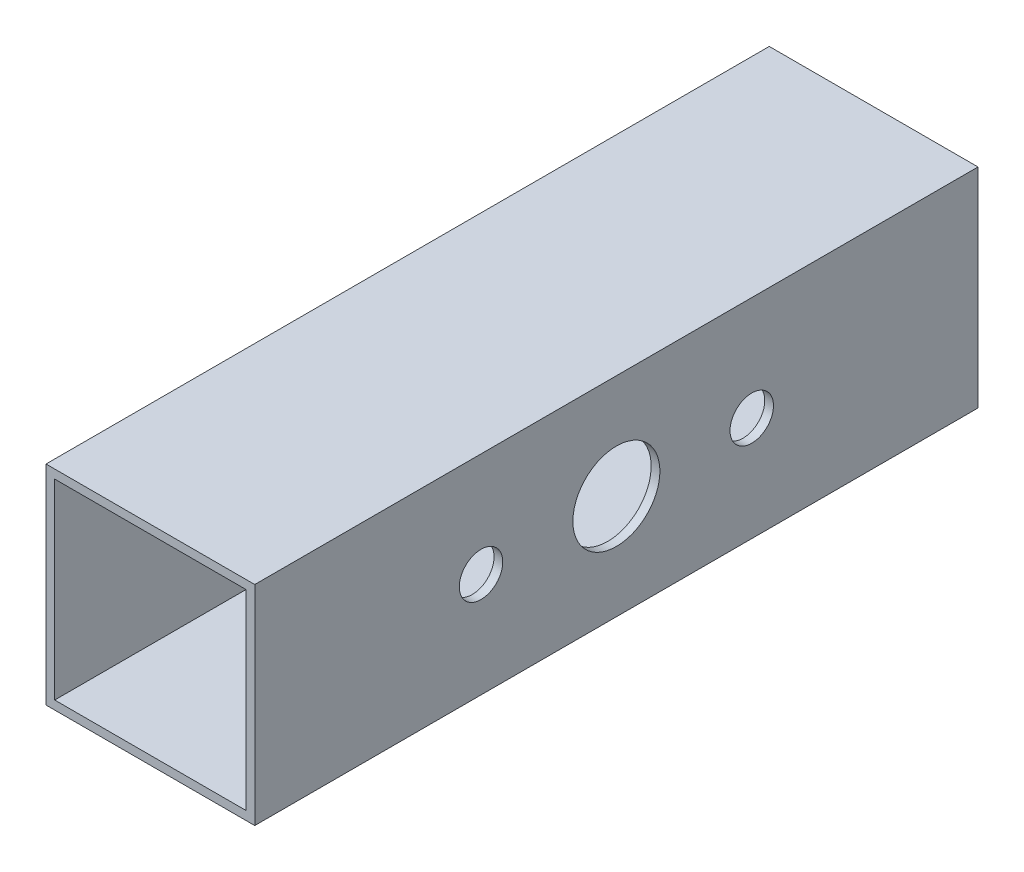
ISO-10303-21;
HEADER;
FILE_DESCRIPTION(('STEP AP214'),'2;1');
FILE_NAME('part.step','',(''),(''),'','','');
FILE_SCHEMA(('AUTOMOTIVE_DESIGN { 1 0 10303 214 1 1 1 1 }'));
ENDSEC;
DATA;
#1=APPLICATION_CONTEXT('core data for automotive mechanical design processes');
#2=APPLICATION_PROTOCOL_DEFINITION('international standard','automotive_design',2000,#1);
#3=PRODUCT_CONTEXT('',#1,'mechanical');
#4=PRODUCT('Part','Part','',(#3));
#5=PRODUCT_RELATED_PRODUCT_CATEGORY('part','',(#4));
#6=PRODUCT_DEFINITION_FORMATION('','',#4);
#7=PRODUCT_DEFINITION_CONTEXT('part definition',#1,'design');
#8=PRODUCT_DEFINITION('design','',#6,#7);
#9=PRODUCT_DEFINITION_SHAPE('','',#8);
#10=(LENGTH_UNIT() NAMED_UNIT(*) SI_UNIT(.MILLI.,.METRE.));
#11=(NAMED_UNIT(*) PLANE_ANGLE_UNIT() SI_UNIT($,.RADIAN.));
#12=(NAMED_UNIT(*) SI_UNIT($,.STERADIAN.) SOLID_ANGLE_UNIT());
#13=UNCERTAINTY_MEASURE_WITH_UNIT(LENGTH_MEASURE(1.E-05),#10,'distance_accuracy_value','');
#14=(GEOMETRIC_REPRESENTATION_CONTEXT(3) GLOBAL_UNCERTAINTY_ASSIGNED_CONTEXT((#13)) GLOBAL_UNIT_ASSIGNED_CONTEXT((#10,
#11,#12)) REPRESENTATION_CONTEXT('',''));
#15=CARTESIAN_POINT('',(0.,0.,0.));
#16=DIRECTION('',(0.,0.,1.));
#17=DIRECTION('',(1.,0.,0.));
#18=AXIS2_PLACEMENT_3D('',#15,#16,#17);
#19=CARTESIAN_POINT('',(0.,0.,132.));
#20=DIRECTION('',(0.,0.,-1.));
#21=DIRECTION('',(-1.,0.,0.));
#22=AXIS2_PLACEMENT_3D('',#19,#20,#21);
#23=PLANE('',#22);
#24=DIRECTION('',(0.,1.,0.));
#25=VECTOR('',#24,1.);
#26=CARTESIAN_POINT('',(-38.1,-38.1,132.));
#27=LINE('',#26,#25);
#28=CARTESIAN_POINT('',(-38.1,-38.1,132.));
#29=VERTEX_POINT('',#28);
#30=CARTESIAN_POINT('',(-38.1,38.1,132.));
#31=VERTEX_POINT('',#30);
#32=EDGE_CURVE('E167',#29,#31,#27,.T.);
#33=ORIENTED_EDGE('',*,*,#32,.F.);
#34=DIRECTION('',(1.,0.,0.));
#35=VECTOR('',#34,1.);
#36=CARTESIAN_POINT('',(-38.1,-38.1,132.));
#37=LINE('',#36,#35);
#38=CARTESIAN_POINT('',(38.1,-38.1,132.));
#39=VERTEX_POINT('',#38);
#40=EDGE_CURVE('E175',#29,#39,#37,.T.);
#41=ORIENTED_EDGE('',*,*,#40,.T.);
#42=DIRECTION('',(0.,1.,0.));
#43=VECTOR('',#42,1.);
#44=CARTESIAN_POINT('',(38.1,-38.1,132.));
#45=LINE('',#44,#43);
#46=CARTESIAN_POINT('',(38.1,38.1,132.));
#47=VERTEX_POINT('',#46);
#48=EDGE_CURVE('E174',#39,#47,#45,.T.);
#49=ORIENTED_EDGE('',*,*,#48,.T.);
#50=DIRECTION('',(1.,0.,0.));
#51=VECTOR('',#50,1.);
#52=CARTESIAN_POINT('',(-38.1,38.1,132.));
#53=LINE('',#52,#51);
#54=EDGE_CURVE('E166',#31,#47,#53,.T.);
#55=ORIENTED_EDGE('',*,*,#54,.F.);
#56=EDGE_LOOP('',(#33,#41,#49,#55));
#57=FACE_BOUND('',#56,.T.);
#58=DIRECTION('',(1.,0.,0.));
#59=VECTOR('',#58,1.);
#60=CARTESIAN_POINT('',(0.,-34.925,132.));
#61=LINE('',#60,#59);
#62=CARTESIAN_POINT('',(-34.925,-34.925,132.));
#63=VERTEX_POINT('',#62);
#64=CARTESIAN_POINT('',(34.925,-34.925,132.));
#65=VERTEX_POINT('',#64);
#66=EDGE_CURVE('E129',#63,#65,#61,.T.);
#67=ORIENTED_EDGE('',*,*,#66,.F.);
#68=DIRECTION('',(0.,1.,0.));
#69=VECTOR('',#68,1.);
#70=CARTESIAN_POINT('',(-34.925,0.,132.));
#71=LINE('',#70,#69);
#72=CARTESIAN_POINT('',(-34.925,34.925,132.));
#73=VERTEX_POINT('',#72);
#74=EDGE_CURVE('E149',#63,#73,#71,.T.);
#75=ORIENTED_EDGE('',*,*,#74,.T.);
#76=DIRECTION('',(1.,0.,0.));
#77=VECTOR('',#76,1.);
#78=CARTESIAN_POINT('',(0.,34.925,132.));
#79=LINE('',#78,#77);
#80=CARTESIAN_POINT('',(34.925,34.925,132.));
#81=VERTEX_POINT('',#80);
#82=EDGE_CURVE('E80',#73,#81,#79,.T.);
#83=ORIENTED_EDGE('',*,*,#82,.T.);
#84=DIRECTION('',(0.,1.,0.));
#85=VECTOR('',#84,1.);
#86=CARTESIAN_POINT('',(34.925,0.,132.));
#87=LINE('',#86,#85);
#88=EDGE_CURVE('E139',#65,#81,#87,.T.);
#89=ORIENTED_EDGE('',*,*,#88,.F.);
#90=EDGE_LOOP('',(#67,#75,#83,#89));
#91=FACE_BOUND('',#90,.T.);
#92=ADVANCED_FACE('F64',(#57,#91),#23,.F.);
#93=CARTESIAN_POINT('',(0.,0.,-132.));
#94=DIRECTION('',(0.,0.,-1.));
#95=DIRECTION('',(-1.,0.,0.));
#96=AXIS2_PLACEMENT_3D('',#93,#94,#95);
#97=PLANE('',#96);
#98=DIRECTION('',(0.,1.,0.));
#99=VECTOR('',#98,1.);
#100=CARTESIAN_POINT('',(-38.1,-38.1,-132.));
#101=LINE('',#100,#99);
#102=CARTESIAN_POINT('',(-38.1,-38.1,-132.));
#103=VERTEX_POINT('',#102);
#104=CARTESIAN_POINT('',(-38.1,38.1,-132.));
#105=VERTEX_POINT('',#104);
#106=EDGE_CURVE('E144',#103,#105,#101,.T.);
#107=ORIENTED_EDGE('',*,*,#106,.T.);
#108=DIRECTION('',(1.,0.,0.));
#109=VECTOR('',#108,1.);
#110=CARTESIAN_POINT('',(-38.1,38.1,-132.));
#111=LINE('',#110,#109);
#112=CARTESIAN_POINT('',(38.1,38.1,-132.));
#113=VERTEX_POINT('',#112);
#114=EDGE_CURVE('E178',#105,#113,#111,.T.);
#115=ORIENTED_EDGE('',*,*,#114,.T.);
#116=DIRECTION('',(0.,1.,0.));
#117=VECTOR('',#116,1.);
#118=CARTESIAN_POINT('',(38.1,-38.1,-132.));
#119=LINE('',#118,#117);
#120=CARTESIAN_POINT('',(38.1,-38.1,-132.));
#121=VERTEX_POINT('',#120);
#122=EDGE_CURVE('E181',#121,#113,#119,.T.);
#123=ORIENTED_EDGE('',*,*,#122,.F.);
#124=DIRECTION('',(1.,0.,0.));
#125=VECTOR('',#124,1.);
#126=CARTESIAN_POINT('',(-38.1,-38.1,-132.));
#127=LINE('',#126,#125);
#128=EDGE_CURVE('E168',#103,#121,#127,.T.);
#129=ORIENTED_EDGE('',*,*,#128,.F.);
#130=EDGE_LOOP('',(#107,#115,#123,#129));
#131=FACE_BOUND('',#130,.T.);
#132=DIRECTION('',(0.,1.,0.));
#133=VECTOR('',#132,1.);
#134=CARTESIAN_POINT('',(-34.925,0.,-132.));
#135=LINE('',#134,#133);
#136=CARTESIAN_POINT('',(-34.925,-34.925,-132.));
#137=VERTEX_POINT('',#136);
#138=CARTESIAN_POINT('',(-34.925,34.925,-132.));
#139=VERTEX_POINT('',#138);
#140=EDGE_CURVE('E136',#137,#139,#135,.T.);
#141=ORIENTED_EDGE('',*,*,#140,.F.);
#142=DIRECTION('',(1.,0.,0.));
#143=VECTOR('',#142,1.);
#144=CARTESIAN_POINT('',(0.,-34.925,-132.));
#145=LINE('',#144,#143);
#146=CARTESIAN_POINT('',(34.925,-34.925,-132.));
#147=VERTEX_POINT('',#146);
#148=EDGE_CURVE('E86',#137,#147,#145,.T.);
#149=ORIENTED_EDGE('',*,*,#148,.T.);
#150=DIRECTION('',(0.,1.,0.));
#151=VECTOR('',#150,1.);
#152=CARTESIAN_POINT('',(34.925,0.,-132.));
#153=LINE('',#152,#151);
#154=CARTESIAN_POINT('',(34.925,34.925,-132.));
#155=VERTEX_POINT('',#154);
#156=EDGE_CURVE('E145',#147,#155,#153,.T.);
#157=ORIENTED_EDGE('',*,*,#156,.T.);
#158=DIRECTION('',(1.,0.,0.));
#159=VECTOR('',#158,1.);
#160=CARTESIAN_POINT('',(0.,34.925,-132.));
#161=LINE('',#160,#159);
#162=EDGE_CURVE('E160',#139,#155,#161,.T.);
#163=ORIENTED_EDGE('',*,*,#162,.F.);
#164=EDGE_LOOP('',(#141,#149,#157,#163));
#165=FACE_BOUND('',#164,.T.);
#166=ADVANCED_FACE('F240',(#131,#165),#97,.T.);
#167=CARTESIAN_POINT('',(-38.1,-38.1,132.));
#168=DIRECTION('',(-1.,0.,0.));
#169=DIRECTION('',(0.,0.,1.));
#170=AXIS2_PLACEMENT_3D('',#167,#168,#169);
#171=PLANE('',#170);
#172=CARTESIAN_POINT('',(-38.1,0.,-49.4109375));
#173=DIRECTION('',(-1.,0.,0.));
#174=DIRECTION('',(0.,0.,1.));
#175=AXIS2_PLACEMENT_3D('',#172,#173,#174);
#176=CIRCLE('',#175,7.93749999999999);
#177=CARTESIAN_POINT('',(-38.1,0.,-41.4734375));
#178=VERTEX_POINT('',#177);
#179=EDGE_CURVE('E281',#178,#178,#176,.T.);
#180=ORIENTED_EDGE('',*,*,#179,.F.);
#181=EDGE_LOOP('',(#180));
#182=FACE_BOUND('',#181,.T.);
#183=CARTESIAN_POINT('',(-38.1,0.,49.4109375));
#184=DIRECTION('',(-1.,0.,0.));
#185=DIRECTION('',(0.,0.,1.));
#186=AXIS2_PLACEMENT_3D('',#183,#184,#185);
#187=CIRCLE('',#186,7.93749999999999);
#188=CARTESIAN_POINT('',(-38.1,0.,57.3484375));
#189=VERTEX_POINT('',#188);
#190=EDGE_CURVE('E285',#189,#189,#187,.T.);
#191=ORIENTED_EDGE('',*,*,#190,.F.);
#192=EDGE_LOOP('',(#191));
#193=FACE_BOUND('',#192,.T.);
#194=CARTESIAN_POINT('',(-38.1,0.,0.));
#195=DIRECTION('',(-1.,0.,0.));
#196=DIRECTION('',(0.,0.,1.));
#197=AXIS2_PLACEMENT_3D('',#194,#195,#196);
#198=CIRCLE('',#197,15.875);
#199=CARTESIAN_POINT('',(-38.1,0.,15.875));
#200=VERTEX_POINT('',#199);
#201=EDGE_CURVE('E208',#200,#200,#198,.T.);
#202=ORIENTED_EDGE('',*,*,#201,.F.);
#203=EDGE_LOOP('',(#202));
#204=FACE_BOUND('',#203,.T.);
#205=ORIENTED_EDGE('',*,*,#106,.F.);
#206=DIRECTION('',(0.,0.,-1.));
#207=VECTOR('',#206,1.);
#208=CARTESIAN_POINT('',(-38.1,-38.1,132.));
#209=LINE('',#208,#207);
#210=EDGE_CURVE('E12',#29,#103,#209,.T.);
#211=ORIENTED_EDGE('',*,*,#210,.F.);
#212=ORIENTED_EDGE('',*,*,#32,.T.);
#213=DIRECTION('',(0.,0.,-1.));
#214=VECTOR('',#213,1.);
#215=CARTESIAN_POINT('',(-38.1,38.1,132.));
#216=LINE('',#215,#214);
#217=EDGE_CURVE('E180',#31,#105,#216,.T.);
#218=ORIENTED_EDGE('',*,*,#217,.T.);
#219=EDGE_LOOP('',(#205,#211,#212,#218));
#220=FACE_BOUND('',#219,.T.);
#221=ADVANCED_FACE('F65',(#182,#193,#204,#220),#171,.T.);
#222=CARTESIAN_POINT('',(-38.1,-38.1,132.));
#223=DIRECTION('',(0.,1.,0.));
#224=DIRECTION('',(0.,0.,1.));
#225=AXIS2_PLACEMENT_3D('',#222,#223,#224);
#226=PLANE('',#225);
#227=ORIENTED_EDGE('',*,*,#128,.T.);
#228=DIRECTION('',(0.,0.,-1.));
#229=VECTOR('',#228,1.);
#230=CARTESIAN_POINT('',(38.1,-38.1,132.));
#231=LINE('',#230,#229);
#232=EDGE_CURVE('E75',#39,#121,#231,.T.);
#233=ORIENTED_EDGE('',*,*,#232,.F.);
#234=ORIENTED_EDGE('',*,*,#40,.F.);
#235=ORIENTED_EDGE('',*,*,#210,.T.);
#236=EDGE_LOOP('',(#227,#233,#234,#235));
#237=FACE_BOUND('',#236,.T.);
#238=ADVANCED_FACE('F246',(#237),#226,.F.);
#239=CARTESIAN_POINT('',(38.1,-38.1,132.));
#240=DIRECTION('',(-1.,0.,0.));
#241=DIRECTION('',(0.,0.,1.));
#242=AXIS2_PLACEMENT_3D('',#239,#240,#241);
#243=PLANE('',#242);
#244=CARTESIAN_POINT('',(38.1,0.,-49.4109375));
#245=DIRECTION('',(-1.,0.,0.));
#246=DIRECTION('',(0.,0.,1.));
#247=AXIS2_PLACEMENT_3D('',#244,#245,#246);
#248=CIRCLE('',#247,7.93749999999999);
#249=CARTESIAN_POINT('',(38.1,0.,-41.4734375));
#250=VERTEX_POINT('',#249);
#251=EDGE_CURVE('E296',#250,#250,#248,.T.);
#252=ORIENTED_EDGE('',*,*,#251,.T.);
#253=EDGE_LOOP('',(#252));
#254=FACE_BOUND('',#253,.T.);
#255=CARTESIAN_POINT('',(38.1,0.,49.4109375));
#256=DIRECTION('',(-1.,0.,0.));
#257=DIRECTION('',(0.,0.,1.));
#258=AXIS2_PLACEMENT_3D('',#255,#256,#257);
#259=CIRCLE('',#258,7.93749999999999);
#260=CARTESIAN_POINT('',(38.1,0.,57.3484375));
#261=VERTEX_POINT('',#260);
#262=EDGE_CURVE('E288',#261,#261,#259,.T.);
#263=ORIENTED_EDGE('',*,*,#262,.T.);
#264=EDGE_LOOP('',(#263));
#265=FACE_BOUND('',#264,.T.);
#266=CARTESIAN_POINT('',(38.1,0.,0.));
#267=DIRECTION('',(-1.,0.,0.));
#268=DIRECTION('',(0.,0.,1.));
#269=AXIS2_PLACEMENT_3D('',#266,#267,#268);
#270=CIRCLE('',#269,15.875);
#271=CARTESIAN_POINT('',(38.1,0.,15.875));
#272=VERTEX_POINT('',#271);
#273=EDGE_CURVE('E193',#272,#272,#270,.T.);
#274=ORIENTED_EDGE('',*,*,#273,.T.);
#275=EDGE_LOOP('',(#274));
#276=FACE_BOUND('',#275,.T.);
#277=ORIENTED_EDGE('',*,*,#122,.T.);
#278=DIRECTION('',(0.,0.,-1.));
#279=VECTOR('',#278,1.);
#280=CARTESIAN_POINT('',(38.1,38.1,132.));
#281=LINE('',#280,#279);
#282=EDGE_CURVE('E188',#47,#113,#281,.T.);
#283=ORIENTED_EDGE('',*,*,#282,.F.);
#284=ORIENTED_EDGE('',*,*,#48,.F.);
#285=ORIENTED_EDGE('',*,*,#232,.T.);
#286=EDGE_LOOP('',(#277,#283,#284,#285));
#287=FACE_BOUND('',#286,.T.);
#288=ADVANCED_FACE('F252',(#254,#265,#276,#287),#243,.F.);
#289=CARTESIAN_POINT('',(-38.1,38.1,132.));
#290=DIRECTION('',(0.,1.,0.));
#291=DIRECTION('',(-1.,0.,0.));
#292=AXIS2_PLACEMENT_3D('',#289,#290,#291);
#293=PLANE('',#292);
#294=ORIENTED_EDGE('',*,*,#114,.F.);
#295=ORIENTED_EDGE('',*,*,#217,.F.);
#296=ORIENTED_EDGE('',*,*,#54,.T.);
#297=ORIENTED_EDGE('',*,*,#282,.T.);
#298=EDGE_LOOP('',(#294,#295,#296,#297));
#299=FACE_BOUND('',#298,.T.);
#300=ADVANCED_FACE('F254',(#299),#293,.T.);
#301=CARTESIAN_POINT('',(0.,-34.925,132.));
#302=DIRECTION('',(0.,1.,0.));
#303=DIRECTION('',(-1.,0.,0.));
#304=AXIS2_PLACEMENT_3D('',#301,#302,#303);
#305=PLANE('',#304);
#306=ORIENTED_EDGE('',*,*,#148,.F.);
#307=DIRECTION('',(0.,0.,-1.));
#308=VECTOR('',#307,1.);
#309=CARTESIAN_POINT('',(-34.925,-34.925,132.));
#310=LINE('',#309,#308);
#311=EDGE_CURVE('E134',#63,#137,#310,.T.);
#312=ORIENTED_EDGE('',*,*,#311,.F.);
#313=ORIENTED_EDGE('',*,*,#66,.T.);
#314=DIRECTION('',(0.,0.,-1.));
#315=VECTOR('',#314,1.);
#316=CARTESIAN_POINT('',(34.925,-34.925,132.));
#317=LINE('',#316,#315);
#318=EDGE_CURVE('E132',#65,#147,#317,.T.);
#319=ORIENTED_EDGE('',*,*,#318,.T.);
#320=EDGE_LOOP('',(#306,#312,#313,#319));
#321=FACE_BOUND('',#320,.T.);
#322=ADVANCED_FACE('F131',(#321),#305,.T.);
#323=CARTESIAN_POINT('',(34.925,0.,132.));
#324=DIRECTION('',(-1.,0.,0.));
#325=DIRECTION('',(0.,0.,1.));
#326=AXIS2_PLACEMENT_3D('',#323,#324,#325);
#327=PLANE('',#326);
#328=CARTESIAN_POINT('',(34.925,0.,-49.4109375));
#329=DIRECTION('',(-1.,0.,0.));
#330=DIRECTION('',(0.,0.,1.));
#331=AXIS2_PLACEMENT_3D('',#328,#329,#330);
#332=CIRCLE('',#331,7.93749999999999);
#333=CARTESIAN_POINT('',(34.925,0.,-41.4734375));
#334=VERTEX_POINT('',#333);
#335=EDGE_CURVE('E154',#334,#334,#332,.T.);
#336=ORIENTED_EDGE('',*,*,#335,.F.);
#337=EDGE_LOOP('',(#336));
#338=FACE_BOUND('',#337,.T.);
#339=CARTESIAN_POINT('',(34.925,0.,49.4109375));
#340=DIRECTION('',(-1.,0.,0.));
#341=DIRECTION('',(0.,0.,1.));
#342=AXIS2_PLACEMENT_3D('',#339,#340,#341);
#343=CIRCLE('',#342,7.93749999999999);
#344=CARTESIAN_POINT('',(34.925,0.,57.3484375));
#345=VERTEX_POINT('',#344);
#346=EDGE_CURVE('E196',#345,#345,#343,.T.);
#347=ORIENTED_EDGE('',*,*,#346,.F.);
#348=EDGE_LOOP('',(#347));
#349=FACE_BOUND('',#348,.T.);
#350=CARTESIAN_POINT('',(34.925,0.,0.));
#351=DIRECTION('',(-1.,0.,0.));
#352=DIRECTION('',(0.,0.,1.));
#353=AXIS2_PLACEMENT_3D('',#350,#351,#352);
#354=CIRCLE('',#353,15.875);
#355=CARTESIAN_POINT('',(34.925,0.,15.875));
#356=VERTEX_POINT('',#355);
#357=EDGE_CURVE('E191',#356,#356,#354,.T.);
#358=ORIENTED_EDGE('',*,*,#357,.F.);
#359=EDGE_LOOP('',(#358));
#360=FACE_BOUND('',#359,.T.);
#361=ORIENTED_EDGE('',*,*,#156,.F.);
#362=ORIENTED_EDGE('',*,*,#318,.F.);
#363=ORIENTED_EDGE('',*,*,#88,.T.);
#364=DIRECTION('',(0.,0.,-1.));
#365=VECTOR('',#364,1.);
#366=CARTESIAN_POINT('',(34.925,34.925,132.));
#367=LINE('',#366,#365);
#368=EDGE_CURVE('E148',#81,#155,#367,.T.);
#369=ORIENTED_EDGE('',*,*,#368,.T.);
#370=EDGE_LOOP('',(#361,#362,#363,#369));
#371=FACE_BOUND('',#370,.T.);
#372=ADVANCED_FACE('F142',(#338,#349,#360,#371),#327,.T.);
#373=CARTESIAN_POINT('',(0.,34.925,132.));
#374=DIRECTION('',(0.,1.,0.));
#375=DIRECTION('',(-1.,0.,0.));
#376=AXIS2_PLACEMENT_3D('',#373,#374,#375);
#377=PLANE('',#376);
#378=ORIENTED_EDGE('',*,*,#162,.T.);
#379=ORIENTED_EDGE('',*,*,#368,.F.);
#380=ORIENTED_EDGE('',*,*,#82,.F.);
#381=DIRECTION('',(0.,0.,-1.));
#382=VECTOR('',#381,1.);
#383=CARTESIAN_POINT('',(-34.925,34.925,132.));
#384=LINE('',#383,#382);
#385=EDGE_CURVE('E162',#73,#139,#384,.T.);
#386=ORIENTED_EDGE('',*,*,#385,.T.);
#387=EDGE_LOOP('',(#378,#379,#380,#386));
#388=FACE_BOUND('',#387,.T.);
#389=ADVANCED_FACE('F314',(#388),#377,.F.);
#390=CARTESIAN_POINT('',(-34.925,0.,132.));
#391=DIRECTION('',(-1.,0.,0.));
#392=DIRECTION('',(0.,0.,1.));
#393=AXIS2_PLACEMENT_3D('',#390,#391,#392);
#394=PLANE('',#393);
#395=CARTESIAN_POINT('',(-34.925,0.,-49.4109375));
#396=DIRECTION('',(-1.,0.,0.));
#397=DIRECTION('',(0.,0.,1.));
#398=AXIS2_PLACEMENT_3D('',#395,#396,#397);
#399=CIRCLE('',#398,7.93749999999999);
#400=CARTESIAN_POINT('',(-34.925,0.,-41.4734375));
#401=VERTEX_POINT('',#400);
#402=EDGE_CURVE('E70',#401,#401,#399,.T.);
#403=ORIENTED_EDGE('',*,*,#402,.T.);
#404=EDGE_LOOP('',(#403));
#405=FACE_BOUND('',#404,.T.);
#406=CARTESIAN_POINT('',(-34.925,0.,49.4109375));
#407=DIRECTION('',(-1.,0.,0.));
#408=DIRECTION('',(0.,0.,1.));
#409=AXIS2_PLACEMENT_3D('',#406,#407,#408);
#410=CIRCLE('',#409,7.93749999999999);
#411=CARTESIAN_POINT('',(-34.925,0.,57.3484375));
#412=VERTEX_POINT('',#411);
#413=EDGE_CURVE('E198',#412,#412,#410,.T.);
#414=ORIENTED_EDGE('',*,*,#413,.T.);
#415=EDGE_LOOP('',(#414));
#416=FACE_BOUND('',#415,.T.);
#417=CARTESIAN_POINT('',(-34.925,0.,0.));
#418=DIRECTION('',(-1.,0.,0.));
#419=DIRECTION('',(0.,0.,1.));
#420=AXIS2_PLACEMENT_3D('',#417,#418,#419);
#421=CIRCLE('',#420,15.875);
#422=CARTESIAN_POINT('',(-34.925,0.,15.875));
#423=VERTEX_POINT('',#422);
#424=EDGE_CURVE('E195',#423,#423,#421,.T.);
#425=ORIENTED_EDGE('',*,*,#424,.T.);
#426=EDGE_LOOP('',(#425));
#427=FACE_BOUND('',#426,.T.);
#428=ORIENTED_EDGE('',*,*,#140,.T.);
#429=ORIENTED_EDGE('',*,*,#385,.F.);
#430=ORIENTED_EDGE('',*,*,#74,.F.);
#431=ORIENTED_EDGE('',*,*,#311,.T.);
#432=EDGE_LOOP('',(#428,#429,#430,#431));
#433=FACE_BOUND('',#432,.T.);
#434=ADVANCED_FACE('F216',(#405,#416,#427,#433),#394,.F.);
#435=CARTESIAN_POINT('',(38.1,0.,0.));
#436=DIRECTION('',(-1.,0.,0.));
#437=DIRECTION('',(0.,0.,1.));
#438=AXIS2_PLACEMENT_3D('',#435,#436,#437);
#439=CYLINDRICAL_SURFACE('',#438,15.875);
#440=CARTESIAN_POINT('',(-38.1,0.,15.875));
#441=CARTESIAN_POINT('',(-38.0669270833333,0.,15.875));
#442=CARTESIAN_POINT('',(-38.0338541666667,0.,15.875));
#443=CARTESIAN_POINT('',(-37.9677083333333,0.,15.875));
#444=CARTESIAN_POINT('',(-37.9346354166667,0.,15.875));
#445=CARTESIAN_POINT('',(-37.8684895833333,0.,15.875));
#446=CARTESIAN_POINT('',(-37.8354166666667,0.,15.875));
#447=CARTESIAN_POINT('',(-37.7692708333333,0.,15.875));
#448=CARTESIAN_POINT('',(-37.7361979166667,0.,15.875));
#449=CARTESIAN_POINT('',(-37.6700520833333,0.,15.875));
#450=CARTESIAN_POINT('',(-37.6369791666667,0.,15.875));
#451=CARTESIAN_POINT('',(-37.5708333333333,0.,15.875));
#452=CARTESIAN_POINT('',(-37.5377604166667,0.,15.875));
#453=CARTESIAN_POINT('',(-37.4716145833333,0.,15.875));
#454=CARTESIAN_POINT('',(-37.4385416666667,0.,15.875));
#455=CARTESIAN_POINT('',(-37.3723958333333,0.,15.875));
#456=CARTESIAN_POINT('',(-37.3393229166667,0.,15.875));
#457=CARTESIAN_POINT('',(-37.2731770833333,0.,15.875));
#458=CARTESIAN_POINT('',(-37.2401041666667,0.,15.875));
#459=CARTESIAN_POINT('',(-37.1739583333333,0.,15.875));
#460=CARTESIAN_POINT('',(-37.1408854166667,0.,15.875));
#461=CARTESIAN_POINT('',(-37.0747395833333,0.,15.875));
#462=CARTESIAN_POINT('',(-37.0416666666667,0.,15.875));
#463=CARTESIAN_POINT('',(-36.9755208333333,0.,15.875));
#464=CARTESIAN_POINT('',(-36.9424479166667,0.,15.875));
#465=CARTESIAN_POINT('',(-36.8763020833333,0.,15.875));
#466=CARTESIAN_POINT('',(-36.8432291666667,0.,15.875));
#467=CARTESIAN_POINT('',(-36.7770833333333,0.,15.875));
#468=CARTESIAN_POINT('',(-36.7440104166667,0.,15.875));
#469=CARTESIAN_POINT('',(-36.6778645833333,0.,15.875));
#470=CARTESIAN_POINT('',(-36.6447916666667,0.,15.875));
#471=CARTESIAN_POINT('',(-36.5786458333333,0.,15.875));
#472=CARTESIAN_POINT('',(-36.5455729166667,0.,15.875));
#473=CARTESIAN_POINT('',(-36.4794270833333,0.,15.875));
#474=CARTESIAN_POINT('',(-36.4463541666667,0.,15.875));
#475=CARTESIAN_POINT('',(-36.3802083333333,0.,15.875));
#476=CARTESIAN_POINT('',(-36.3471354166667,0.,15.875));
#477=CARTESIAN_POINT('',(-36.2809895833333,0.,15.875));
#478=CARTESIAN_POINT('',(-36.2479166666667,0.,15.875));
#479=CARTESIAN_POINT('',(-36.1817708333333,0.,15.875));
#480=CARTESIAN_POINT('',(-36.1486979166667,0.,15.875));
#481=CARTESIAN_POINT('',(-36.0825520833333,0.,15.875));
#482=CARTESIAN_POINT('',(-36.0494791666667,0.,15.875));
#483=CARTESIAN_POINT('',(-35.9833333333333,0.,15.875));
#484=CARTESIAN_POINT('',(-35.9502604166667,0.,15.875));
#485=CARTESIAN_POINT('',(-35.8841145833333,0.,15.875));
#486=CARTESIAN_POINT('',(-35.8510416666667,0.,15.875));
#487=CARTESIAN_POINT('',(-35.7848958333333,0.,15.875));
#488=CARTESIAN_POINT('',(-35.7518229166667,0.,15.875));
#489=CARTESIAN_POINT('',(-35.6856770833333,0.,15.875));
#490=CARTESIAN_POINT('',(-35.6526041666667,0.,15.875));
#491=CARTESIAN_POINT('',(-35.5864583333333,0.,15.875));
#492=CARTESIAN_POINT('',(-35.5533854166667,0.,15.875));
#493=CARTESIAN_POINT('',(-35.4872395833333,0.,15.875));
#494=CARTESIAN_POINT('',(-35.4541666666667,0.,15.875));
#495=CARTESIAN_POINT('',(-35.3880208333333,0.,15.875));
#496=CARTESIAN_POINT('',(-35.3549479166667,0.,15.875));
#497=CARTESIAN_POINT('',(-35.2888020833333,0.,15.875));
#498=CARTESIAN_POINT('',(-35.2557291666667,0.,15.875));
#499=CARTESIAN_POINT('',(-35.1895833333333,0.,15.875));
#500=CARTESIAN_POINT('',(-35.1565104166667,0.,15.875));
#501=CARTESIAN_POINT('',(-35.0903645833333,0.,15.875));
#502=CARTESIAN_POINT('',(-35.0572916666667,0.,15.875));
#503=CARTESIAN_POINT('',(-34.9911458333333,0.,15.875));
#504=CARTESIAN_POINT('',(-34.9580729166667,0.,15.875));
#505=CARTESIAN_POINT('',(-34.925,0.,15.875));
#506=B_SPLINE_CURVE_WITH_KNOTS('',3,(#440,#441,#442,#443,#444,#445,#446,#447,#448,#449,#450,
#451,#452,#453,#454,#455,#456,#457,#458,#459,#460,#461,#462,#463,#464,#465,#466,#467,#468,#469,
#470,#471,#472,#473,#474,#475,#476,#477,#478,#479,#480,#481,#482,#483,#484,#485,#486,#487,#488,
#489,#490,#491,#492,#493,#494,#495,#496,#497,#498,#499,#500,#501,#502,#503,#504,#505),
.UNSPECIFIED.,.F.,.F.,(4,2,2,2,2,2,2,2,2,2,2,2,2,2,2,2,2,2,2,2,2,2,2,2,2,2,2,2,2,2,2,2,4),(0.,
0.0992187500000047,0.198437499999995,0.29765625,0.396875000000005,0.496093749999996,0.5953125,
0.694531250000005,0.79375000000001,0.892968750000001,0.992187500000005,1.09140625000001,
1.190625,1.28984375000001,1.38906250000001,1.48828125,1.58750000000001,1.68671875000001,
1.7859375,1.88515625000001,1.98437500000001,2.08359375,2.18281250000001,2.28203125000001,
2.38125,2.48046875000001,2.57968750000001,2.67890625000002,2.77812500000001,2.87734375000001,
2.97656250000002,3.07578125000001,3.17500000000001),.UNSPECIFIED.);
#507=EDGE_CURVE('BSEAM232',#200,#423,#506,.T.);
#508=ORIENTED_EDGE('',*,*,#201,.T.);
#509=ORIENTED_EDGE('',*,*,#424,.F.);
#510=ORIENTED_EDGE('',*,*,#507,.T.);
#511=ORIENTED_EDGE('',*,*,#507,.F.);
#512=EDGE_LOOP('',(#508,#510,#509,#511));
#513=FACE_BOUND('',#512,.T.);
#514=ADVANCED_FACE('F232',(#513),#439,.F.);
#515=CARTESIAN_POINT('',(38.1,0.,49.4109375));
#516=DIRECTION('',(-1.,0.,0.));
#517=DIRECTION('',(0.,0.,1.));
#518=AXIS2_PLACEMENT_3D('',#515,#516,#517);
#519=CYLINDRICAL_SURFACE('',#518,7.93749999999999);
#520=CARTESIAN_POINT('',(-38.1,0.,57.3484375));
#521=CARTESIAN_POINT('',(-38.0669270833333,0.,57.3484375));
#522=CARTESIAN_POINT('',(-38.0338541666667,0.,57.3484375));
#523=CARTESIAN_POINT('',(-37.9677083333333,0.,57.3484375));
#524=CARTESIAN_POINT('',(-37.9346354166667,0.,57.3484375));
#525=CARTESIAN_POINT('',(-37.8684895833333,0.,57.3484375));
#526=CARTESIAN_POINT('',(-37.8354166666667,0.,57.3484375));
#527=CARTESIAN_POINT('',(-37.7692708333333,0.,57.3484375));
#528=CARTESIAN_POINT('',(-37.7361979166667,0.,57.3484375));
#529=CARTESIAN_POINT('',(-37.6700520833333,0.,57.3484375));
#530=CARTESIAN_POINT('',(-37.6369791666667,0.,57.3484375));
#531=CARTESIAN_POINT('',(-37.5708333333333,0.,57.3484375));
#532=CARTESIAN_POINT('',(-37.5377604166667,0.,57.3484375));
#533=CARTESIAN_POINT('',(-37.4716145833333,0.,57.3484375));
#534=CARTESIAN_POINT('',(-37.4385416666667,0.,57.3484375));
#535=CARTESIAN_POINT('',(-37.3723958333333,0.,57.3484375));
#536=CARTESIAN_POINT('',(-37.3393229166667,0.,57.3484375));
#537=CARTESIAN_POINT('',(-37.2731770833333,0.,57.3484375));
#538=CARTESIAN_POINT('',(-37.2401041666667,0.,57.3484375));
#539=CARTESIAN_POINT('',(-37.1739583333333,0.,57.3484375));
#540=CARTESIAN_POINT('',(-37.1408854166667,0.,57.3484375));
#541=CARTESIAN_POINT('',(-37.0747395833333,0.,57.3484375));
#542=CARTESIAN_POINT('',(-37.0416666666667,0.,57.3484375));
#543=CARTESIAN_POINT('',(-36.9755208333333,0.,57.3484375));
#544=CARTESIAN_POINT('',(-36.9424479166667,0.,57.3484375));
#545=CARTESIAN_POINT('',(-36.8763020833333,0.,57.3484375));
#546=CARTESIAN_POINT('',(-36.8432291666667,0.,57.3484375));
#547=CARTESIAN_POINT('',(-36.7770833333333,0.,57.3484375));
#548=CARTESIAN_POINT('',(-36.7440104166667,0.,57.3484375));
#549=CARTESIAN_POINT('',(-36.6778645833333,0.,57.3484375));
#550=CARTESIAN_POINT('',(-36.6447916666667,0.,57.3484375));
#551=CARTESIAN_POINT('',(-36.5786458333333,0.,57.3484375));
#552=CARTESIAN_POINT('',(-36.5455729166667,0.,57.3484375));
#553=CARTESIAN_POINT('',(-36.4794270833333,0.,57.3484375));
#554=CARTESIAN_POINT('',(-36.4463541666667,0.,57.3484375));
#555=CARTESIAN_POINT('',(-36.3802083333333,0.,57.3484375));
#556=CARTESIAN_POINT('',(-36.3471354166667,0.,57.3484375));
#557=CARTESIAN_POINT('',(-36.2809895833333,0.,57.3484375));
#558=CARTESIAN_POINT('',(-36.2479166666667,0.,57.3484375));
#559=CARTESIAN_POINT('',(-36.1817708333333,0.,57.3484375));
#560=CARTESIAN_POINT('',(-36.1486979166667,0.,57.3484375));
#561=CARTESIAN_POINT('',(-36.0825520833333,0.,57.3484375));
#562=CARTESIAN_POINT('',(-36.0494791666667,0.,57.3484375));
#563=CARTESIAN_POINT('',(-35.9833333333333,0.,57.3484375));
#564=CARTESIAN_POINT('',(-35.9502604166667,0.,57.3484375));
#565=CARTESIAN_POINT('',(-35.8841145833333,0.,57.3484375));
#566=CARTESIAN_POINT('',(-35.8510416666667,0.,57.3484375));
#567=CARTESIAN_POINT('',(-35.7848958333333,0.,57.3484375));
#568=CARTESIAN_POINT('',(-35.7518229166667,0.,57.3484375));
#569=CARTESIAN_POINT('',(-35.6856770833333,0.,57.3484375));
#570=CARTESIAN_POINT('',(-35.6526041666667,0.,57.3484375));
#571=CARTESIAN_POINT('',(-35.5864583333333,0.,57.3484375));
#572=CARTESIAN_POINT('',(-35.5533854166667,0.,57.3484375));
#573=CARTESIAN_POINT('',(-35.4872395833333,0.,57.3484375));
#574=CARTESIAN_POINT('',(-35.4541666666667,0.,57.3484375));
#575=CARTESIAN_POINT('',(-35.3880208333333,0.,57.3484375));
#576=CARTESIAN_POINT('',(-35.3549479166667,0.,57.3484375));
#577=CARTESIAN_POINT('',(-35.2888020833333,0.,57.3484375));
#578=CARTESIAN_POINT('',(-35.2557291666667,0.,57.3484375));
#579=CARTESIAN_POINT('',(-35.1895833333333,0.,57.3484375));
#580=CARTESIAN_POINT('',(-35.1565104166667,0.,57.3484375));
#581=CARTESIAN_POINT('',(-35.0903645833333,0.,57.3484375));
#582=CARTESIAN_POINT('',(-35.0572916666667,0.,57.3484375));
#583=CARTESIAN_POINT('',(-34.9911458333333,0.,57.3484375));
#584=CARTESIAN_POINT('',(-34.9580729166667,0.,57.3484375));
#585=CARTESIAN_POINT('',(-34.925,0.,57.3484375));
#586=B_SPLINE_CURVE_WITH_KNOTS('',3,(#520,#521,#522,#523,#524,#525,#526,#527,#528,#529,#530,
#531,#532,#533,#534,#535,#536,#537,#538,#539,#540,#541,#542,#543,#544,#545,#546,#547,#548,#549,
#550,#551,#552,#553,#554,#555,#556,#557,#558,#559,#560,#561,#562,#563,#564,#565,#566,#567,#568,
#569,#570,#571,#572,#573,#574,#575,#576,#577,#578,#579,#580,#581,#582,#583,#584,#585),
.UNSPECIFIED.,.F.,.F.,(4,2,2,2,2,2,2,2,2,2,2,2,2,2,2,2,2,2,2,2,2,2,2,2,2,2,2,2,2,2,2,2,4),(0.,
0.0992187500000047,0.198437499999995,0.29765625,0.396875000000005,0.496093749999996,0.5953125,
0.694531250000005,0.79375000000001,0.892968750000001,0.992187500000005,1.09140625000001,
1.190625,1.28984375000001,1.38906250000001,1.48828125,1.58750000000001,1.68671875000001,
1.7859375,1.88515625000001,1.98437500000001,2.08359375,2.18281250000001,2.28203125000001,
2.38125,2.48046875000001,2.57968750000001,2.67890625000002,2.77812500000001,2.87734375000001,
2.97656250000002,3.07578125000001,3.17500000000001),.UNSPECIFIED.);
#587=EDGE_CURVE('BSEAM222',#189,#412,#586,.T.);
#588=ORIENTED_EDGE('',*,*,#190,.T.);
#589=ORIENTED_EDGE('',*,*,#413,.F.);
#590=ORIENTED_EDGE('',*,*,#587,.T.);
#591=ORIENTED_EDGE('',*,*,#587,.F.);
#592=EDGE_LOOP('',(#588,#590,#589,#591));
#593=FACE_BOUND('',#592,.T.);
#594=ADVANCED_FACE('F222',(#593),#519,.F.);
#595=CARTESIAN_POINT('',(38.1,0.,-49.4109375));
#596=DIRECTION('',(-1.,0.,0.));
#597=DIRECTION('',(0.,0.,1.));
#598=AXIS2_PLACEMENT_3D('',#595,#596,#597);
#599=CYLINDRICAL_SURFACE('',#598,7.93749999999999);
#600=CARTESIAN_POINT('',(-38.1,0.,-41.4734375));
#601=CARTESIAN_POINT('',(-38.0669270833333,0.,-41.4734375));
#602=CARTESIAN_POINT('',(-38.0338541666667,0.,-41.4734375));
#603=CARTESIAN_POINT('',(-37.9677083333333,0.,-41.4734375));
#604=CARTESIAN_POINT('',(-37.9346354166667,0.,-41.4734375));
#605=CARTESIAN_POINT('',(-37.8684895833333,0.,-41.4734375));
#606=CARTESIAN_POINT('',(-37.8354166666667,0.,-41.4734375));
#607=CARTESIAN_POINT('',(-37.7692708333333,0.,-41.4734375));
#608=CARTESIAN_POINT('',(-37.7361979166667,0.,-41.4734375));
#609=CARTESIAN_POINT('',(-37.6700520833333,0.,-41.4734375));
#610=CARTESIAN_POINT('',(-37.6369791666667,0.,-41.4734375));
#611=CARTESIAN_POINT('',(-37.5708333333333,0.,-41.4734375));
#612=CARTESIAN_POINT('',(-37.5377604166667,0.,-41.4734375));
#613=CARTESIAN_POINT('',(-37.4716145833333,0.,-41.4734375));
#614=CARTESIAN_POINT('',(-37.4385416666667,0.,-41.4734375));
#615=CARTESIAN_POINT('',(-37.3723958333333,0.,-41.4734375));
#616=CARTESIAN_POINT('',(-37.3393229166667,0.,-41.4734375));
#617=CARTESIAN_POINT('',(-37.2731770833333,0.,-41.4734375));
#618=CARTESIAN_POINT('',(-37.2401041666667,0.,-41.4734375));
#619=CARTESIAN_POINT('',(-37.1739583333333,0.,-41.4734375));
#620=CARTESIAN_POINT('',(-37.1408854166667,0.,-41.4734375));
#621=CARTESIAN_POINT('',(-37.0747395833333,0.,-41.4734375));
#622=CARTESIAN_POINT('',(-37.0416666666667,0.,-41.4734375));
#623=CARTESIAN_POINT('',(-36.9755208333333,0.,-41.4734375));
#624=CARTESIAN_POINT('',(-36.9424479166667,0.,-41.4734375));
#625=CARTESIAN_POINT('',(-36.8763020833333,0.,-41.4734375));
#626=CARTESIAN_POINT('',(-36.8432291666667,0.,-41.4734375));
#627=CARTESIAN_POINT('',(-36.7770833333333,0.,-41.4734375));
#628=CARTESIAN_POINT('',(-36.7440104166667,0.,-41.4734375));
#629=CARTESIAN_POINT('',(-36.6778645833333,0.,-41.4734375));
#630=CARTESIAN_POINT('',(-36.6447916666667,0.,-41.4734375));
#631=CARTESIAN_POINT('',(-36.5786458333333,0.,-41.4734375));
#632=CARTESIAN_POINT('',(-36.5455729166667,0.,-41.4734375));
#633=CARTESIAN_POINT('',(-36.4794270833333,0.,-41.4734375));
#634=CARTESIAN_POINT('',(-36.4463541666667,0.,-41.4734375));
#635=CARTESIAN_POINT('',(-36.3802083333333,0.,-41.4734375));
#636=CARTESIAN_POINT('',(-36.3471354166667,0.,-41.4734375));
#637=CARTESIAN_POINT('',(-36.2809895833333,0.,-41.4734375));
#638=CARTESIAN_POINT('',(-36.2479166666667,0.,-41.4734375));
#639=CARTESIAN_POINT('',(-36.1817708333333,0.,-41.4734375));
#640=CARTESIAN_POINT('',(-36.1486979166667,0.,-41.4734375));
#641=CARTESIAN_POINT('',(-36.0825520833333,0.,-41.4734375));
#642=CARTESIAN_POINT('',(-36.0494791666667,0.,-41.4734375));
#643=CARTESIAN_POINT('',(-35.9833333333333,0.,-41.4734375));
#644=CARTESIAN_POINT('',(-35.9502604166667,0.,-41.4734375));
#645=CARTESIAN_POINT('',(-35.8841145833333,0.,-41.4734375));
#646=CARTESIAN_POINT('',(-35.8510416666667,0.,-41.4734375));
#647=CARTESIAN_POINT('',(-35.7848958333333,0.,-41.4734375));
#648=CARTESIAN_POINT('',(-35.7518229166667,0.,-41.4734375));
#649=CARTESIAN_POINT('',(-35.6856770833333,0.,-41.4734375));
#650=CARTESIAN_POINT('',(-35.6526041666667,0.,-41.4734375));
#651=CARTESIAN_POINT('',(-35.5864583333333,0.,-41.4734375));
#652=CARTESIAN_POINT('',(-35.5533854166667,0.,-41.4734375));
#653=CARTESIAN_POINT('',(-35.4872395833333,0.,-41.4734375));
#654=CARTESIAN_POINT('',(-35.4541666666667,0.,-41.4734375));
#655=CARTESIAN_POINT('',(-35.3880208333333,0.,-41.4734375));
#656=CARTESIAN_POINT('',(-35.3549479166667,0.,-41.4734375));
#657=CARTESIAN_POINT('',(-35.2888020833333,0.,-41.4734375));
#658=CARTESIAN_POINT('',(-35.2557291666667,0.,-41.4734375));
#659=CARTESIAN_POINT('',(-35.1895833333333,0.,-41.4734375));
#660=CARTESIAN_POINT('',(-35.1565104166667,0.,-41.4734375));
#661=CARTESIAN_POINT('',(-35.0903645833333,0.,-41.4734375));
#662=CARTESIAN_POINT('',(-35.0572916666667,0.,-41.4734375));
#663=CARTESIAN_POINT('',(-34.9911458333333,0.,-41.4734375));
#664=CARTESIAN_POINT('',(-34.9580729166667,0.,-41.4734375));
#665=CARTESIAN_POINT('',(-34.925,0.,-41.4734375));
#666=B_SPLINE_CURVE_WITH_KNOTS('',3,(#600,#601,#602,#603,#604,#605,#606,#607,#608,#609,#610,
#611,#612,#613,#614,#615,#616,#617,#618,#619,#620,#621,#622,#623,#624,#625,#626,#627,#628,#629,
#630,#631,#632,#633,#634,#635,#636,#637,#638,#639,#640,#641,#642,#643,#644,#645,#646,#647,#648,
#649,#650,#651,#652,#653,#654,#655,#656,#657,#658,#659,#660,#661,#662,#663,#664,#665),
.UNSPECIFIED.,.F.,.F.,(4,2,2,2,2,2,2,2,2,2,2,2,2,2,2,2,2,2,2,2,2,2,2,2,2,2,2,2,2,2,2,2,4),(0.,
0.0992187500000047,0.198437499999995,0.29765625,0.396875000000005,0.496093749999996,0.5953125,
0.694531250000005,0.79375000000001,0.892968750000001,0.992187500000005,1.09140625000001,
1.190625,1.28984375000001,1.38906250000001,1.48828125,1.58750000000001,1.68671875000001,
1.7859375,1.88515625000001,1.98437500000001,2.08359375,2.18281250000001,2.28203125000001,
2.38125,2.48046875000001,2.57968750000001,2.67890625000002,2.77812500000001,2.87734375000001,
2.97656250000002,3.07578125000001,3.17500000000001),.UNSPECIFIED.);
#667=EDGE_CURVE('BSEAM217',#178,#401,#666,.T.);
#668=ORIENTED_EDGE('',*,*,#179,.T.);
#669=ORIENTED_EDGE('',*,*,#402,.F.);
#670=ORIENTED_EDGE('',*,*,#667,.T.);
#671=ORIENTED_EDGE('',*,*,#667,.F.);
#672=EDGE_LOOP('',(#668,#670,#669,#671));
#673=FACE_BOUND('',#672,.T.);
#674=ADVANCED_FACE('F217',(#673),#599,.F.);
#675=CARTESIAN_POINT('',(34.925,0.,15.875));
#676=CARTESIAN_POINT('',(34.9580729166667,0.,15.875));
#677=CARTESIAN_POINT('',(34.9911458333333,0.,15.875));
#678=CARTESIAN_POINT('',(35.0572916666667,0.,15.875));
#679=CARTESIAN_POINT('',(35.0903645833333,0.,15.875));
#680=CARTESIAN_POINT('',(35.1565104166667,0.,15.875));
#681=CARTESIAN_POINT('',(35.1895833333333,0.,15.875));
#682=CARTESIAN_POINT('',(35.2557291666667,0.,15.875));
#683=CARTESIAN_POINT('',(35.2888020833333,0.,15.875));
#684=CARTESIAN_POINT('',(35.3549479166667,0.,15.875));
#685=CARTESIAN_POINT('',(35.3880208333333,0.,15.875));
#686=CARTESIAN_POINT('',(35.4541666666667,0.,15.875));
#687=CARTESIAN_POINT('',(35.4872395833333,0.,15.875));
#688=CARTESIAN_POINT('',(35.5533854166667,0.,15.875));
#689=CARTESIAN_POINT('',(35.5864583333333,0.,15.875));
#690=CARTESIAN_POINT('',(35.6526041666667,0.,15.875));
#691=CARTESIAN_POINT('',(35.6856770833333,0.,15.875));
#692=CARTESIAN_POINT('',(35.7518229166667,0.,15.875));
#693=CARTESIAN_POINT('',(35.7848958333333,0.,15.875));
#694=CARTESIAN_POINT('',(35.8510416666667,0.,15.875));
#695=CARTESIAN_POINT('',(35.8841145833333,0.,15.875));
#696=CARTESIAN_POINT('',(35.9502604166667,0.,15.875));
#697=CARTESIAN_POINT('',(35.9833333333333,0.,15.875));
#698=CARTESIAN_POINT('',(36.0494791666667,0.,15.875));
#699=CARTESIAN_POINT('',(36.0825520833333,0.,15.875));
#700=CARTESIAN_POINT('',(36.1486979166667,0.,15.875));
#701=CARTESIAN_POINT('',(36.1817708333333,0.,15.875));
#702=CARTESIAN_POINT('',(36.2479166666667,0.,15.875));
#703=CARTESIAN_POINT('',(36.2809895833333,0.,15.875));
#704=CARTESIAN_POINT('',(36.3471354166667,0.,15.875));
#705=CARTESIAN_POINT('',(36.3802083333333,0.,15.875));
#706=CARTESIAN_POINT('',(36.4463541666667,0.,15.875));
#707=CARTESIAN_POINT('',(36.4794270833333,0.,15.875));
#708=CARTESIAN_POINT('',(36.5455729166667,0.,15.875));
#709=CARTESIAN_POINT('',(36.5786458333333,0.,15.875));
#710=CARTESIAN_POINT('',(36.6447916666667,0.,15.875));
#711=CARTESIAN_POINT('',(36.6778645833333,0.,15.875));
#712=CARTESIAN_POINT('',(36.7440104166667,0.,15.875));
#713=CARTESIAN_POINT('',(36.7770833333333,0.,15.875));
#714=CARTESIAN_POINT('',(36.8432291666667,0.,15.875));
#715=CARTESIAN_POINT('',(36.8763020833333,0.,15.875));
#716=CARTESIAN_POINT('',(36.9424479166667,0.,15.875));
#717=CARTESIAN_POINT('',(36.9755208333333,0.,15.875));
#718=CARTESIAN_POINT('',(37.0416666666667,0.,15.875));
#719=CARTESIAN_POINT('',(37.0747395833333,0.,15.875));
#720=CARTESIAN_POINT('',(37.1408854166667,0.,15.875));
#721=CARTESIAN_POINT('',(37.1739583333333,0.,15.875));
#722=CARTESIAN_POINT('',(37.2401041666667,0.,15.875));
#723=CARTESIAN_POINT('',(37.2731770833333,0.,15.875));
#724=CARTESIAN_POINT('',(37.3393229166667,0.,15.875));
#725=CARTESIAN_POINT('',(37.3723958333333,0.,15.875));
#726=CARTESIAN_POINT('',(37.4385416666667,0.,15.875));
#727=CARTESIAN_POINT('',(37.4716145833333,0.,15.875));
#728=CARTESIAN_POINT('',(37.5377604166667,0.,15.875));
#729=CARTESIAN_POINT('',(37.5708333333333,0.,15.875));
#730=CARTESIAN_POINT('',(37.6369791666667,0.,15.875));
#731=CARTESIAN_POINT('',(37.6700520833333,0.,15.875));
#732=CARTESIAN_POINT('',(37.7361979166667,0.,15.875));
#733=CARTESIAN_POINT('',(37.7692708333333,0.,15.875));
#734=CARTESIAN_POINT('',(37.8354166666667,0.,15.875));
#735=CARTESIAN_POINT('',(37.8684895833333,0.,15.875));
#736=CARTESIAN_POINT('',(37.9346354166667,0.,15.875));
#737=CARTESIAN_POINT('',(37.9677083333333,0.,15.875));
#738=CARTESIAN_POINT('',(38.0338541666667,0.,15.875));
#739=CARTESIAN_POINT('',(38.0669270833333,0.,15.875));
#740=CARTESIAN_POINT('',(38.1,0.,15.875));
#741=B_SPLINE_CURVE_WITH_KNOTS('',3,(#675,#676,#677,#678,#679,#680,#681,#682,#683,#684,#685,
#686,#687,#688,#689,#690,#691,#692,#693,#694,#695,#696,#697,#698,#699,#700,#701,#702,#703,#704,
#705,#706,#707,#708,#709,#710,#711,#712,#713,#714,#715,#716,#717,#718,#719,#720,#721,#722,#723,
#724,#725,#726,#727,#728,#729,#730,#731,#732,#733,#734,#735,#736,#737,#738,#739,#740),
.UNSPECIFIED.,.F.,.F.,(4,2,2,2,2,2,2,2,2,2,2,2,2,2,2,2,2,2,2,2,2,2,2,2,2,2,2,2,2,2,2,2,4),(0.,
0.0992187500000047,0.198437500000002,0.29765625,0.396875000000005,0.496093750000003,0.5953125,
0.694531250000005,0.793750000000003,0.892968750000001,0.992187500000005,1.09140625,1.190625,
1.28984375000001,1.3890625,1.48828125,1.5875,1.68671875,1.7859375,1.88515625,1.984375,
2.08359375,2.1828125,2.28203125,2.38125,2.48046875,2.5796875,2.67890625,2.778125,2.87734375,
2.9765625,3.07578125,3.175),.UNSPECIFIED.);
#742=EDGE_CURVE('BSEAM219',#356,#272,#741,.T.);
#743=ORIENTED_EDGE('',*,*,#357,.T.);
#744=ORIENTED_EDGE('',*,*,#273,.F.);
#745=ORIENTED_EDGE('',*,*,#742,.T.);
#746=ORIENTED_EDGE('',*,*,#742,.F.);
#747=EDGE_LOOP('',(#743,#745,#744,#746));
#748=FACE_BOUND('',#747,.T.);
#749=ADVANCED_FACE('F219',(#748),#439,.F.);
#750=CARTESIAN_POINT('',(34.925,0.,57.3484375));
#751=CARTESIAN_POINT('',(34.9580729166667,0.,57.3484375));
#752=CARTESIAN_POINT('',(34.9911458333333,0.,57.3484375));
#753=CARTESIAN_POINT('',(35.0572916666667,0.,57.3484375));
#754=CARTESIAN_POINT('',(35.0903645833333,0.,57.3484375));
#755=CARTESIAN_POINT('',(35.1565104166667,0.,57.3484375));
#756=CARTESIAN_POINT('',(35.1895833333333,0.,57.3484375));
#757=CARTESIAN_POINT('',(35.2557291666667,0.,57.3484375));
#758=CARTESIAN_POINT('',(35.2888020833333,0.,57.3484375));
#759=CARTESIAN_POINT('',(35.3549479166667,0.,57.3484375));
#760=CARTESIAN_POINT('',(35.3880208333333,0.,57.3484375));
#761=CARTESIAN_POINT('',(35.4541666666667,0.,57.3484375));
#762=CARTESIAN_POINT('',(35.4872395833333,0.,57.3484375));
#763=CARTESIAN_POINT('',(35.5533854166667,0.,57.3484375));
#764=CARTESIAN_POINT('',(35.5864583333333,0.,57.3484375));
#765=CARTESIAN_POINT('',(35.6526041666667,0.,57.3484375));
#766=CARTESIAN_POINT('',(35.6856770833333,0.,57.3484375));
#767=CARTESIAN_POINT('',(35.7518229166667,0.,57.3484375));
#768=CARTESIAN_POINT('',(35.7848958333333,0.,57.3484375));
#769=CARTESIAN_POINT('',(35.8510416666667,0.,57.3484375));
#770=CARTESIAN_POINT('',(35.8841145833333,0.,57.3484375));
#771=CARTESIAN_POINT('',(35.9502604166667,0.,57.3484375));
#772=CARTESIAN_POINT('',(35.9833333333333,0.,57.3484375));
#773=CARTESIAN_POINT('',(36.0494791666667,0.,57.3484375));
#774=CARTESIAN_POINT('',(36.0825520833333,0.,57.3484375));
#775=CARTESIAN_POINT('',(36.1486979166667,0.,57.3484375));
#776=CARTESIAN_POINT('',(36.1817708333333,0.,57.3484375));
#777=CARTESIAN_POINT('',(36.2479166666667,0.,57.3484375));
#778=CARTESIAN_POINT('',(36.2809895833333,0.,57.3484375));
#779=CARTESIAN_POINT('',(36.3471354166667,0.,57.3484375));
#780=CARTESIAN_POINT('',(36.3802083333333,0.,57.3484375));
#781=CARTESIAN_POINT('',(36.4463541666667,0.,57.3484375));
#782=CARTESIAN_POINT('',(36.4794270833333,0.,57.3484375));
#783=CARTESIAN_POINT('',(36.5455729166667,0.,57.3484375));
#784=CARTESIAN_POINT('',(36.5786458333333,0.,57.3484375));
#785=CARTESIAN_POINT('',(36.6447916666667,0.,57.3484375));
#786=CARTESIAN_POINT('',(36.6778645833333,0.,57.3484375));
#787=CARTESIAN_POINT('',(36.7440104166667,0.,57.3484375));
#788=CARTESIAN_POINT('',(36.7770833333333,0.,57.3484375));
#789=CARTESIAN_POINT('',(36.8432291666667,0.,57.3484375));
#790=CARTESIAN_POINT('',(36.8763020833333,0.,57.3484375));
#791=CARTESIAN_POINT('',(36.9424479166667,0.,57.3484375));
#792=CARTESIAN_POINT('',(36.9755208333333,0.,57.3484375));
#793=CARTESIAN_POINT('',(37.0416666666667,0.,57.3484375));
#794=CARTESIAN_POINT('',(37.0747395833333,0.,57.3484375));
#795=CARTESIAN_POINT('',(37.1408854166667,0.,57.3484375));
#796=CARTESIAN_POINT('',(37.1739583333333,0.,57.3484375));
#797=CARTESIAN_POINT('',(37.2401041666667,0.,57.3484375));
#798=CARTESIAN_POINT('',(37.2731770833333,0.,57.3484375));
#799=CARTESIAN_POINT('',(37.3393229166667,0.,57.3484375));
#800=CARTESIAN_POINT('',(37.3723958333333,0.,57.3484375));
#801=CARTESIAN_POINT('',(37.4385416666667,0.,57.3484375));
#802=CARTESIAN_POINT('',(37.4716145833333,0.,57.3484375));
#803=CARTESIAN_POINT('',(37.5377604166667,0.,57.3484375));
#804=CARTESIAN_POINT('',(37.5708333333333,0.,57.3484375));
#805=CARTESIAN_POINT('',(37.6369791666667,0.,57.3484375));
#806=CARTESIAN_POINT('',(37.6700520833333,0.,57.3484375));
#807=CARTESIAN_POINT('',(37.7361979166667,0.,57.3484375));
#808=CARTESIAN_POINT('',(37.7692708333333,0.,57.3484375));
#809=CARTESIAN_POINT('',(37.8354166666667,0.,57.3484375));
#810=CARTESIAN_POINT('',(37.8684895833333,0.,57.3484375));
#811=CARTESIAN_POINT('',(37.9346354166667,0.,57.3484375));
#812=CARTESIAN_POINT('',(37.9677083333333,0.,57.3484375));
#813=CARTESIAN_POINT('',(38.0338541666667,0.,57.3484375));
#814=CARTESIAN_POINT('',(38.0669270833333,0.,57.3484375));
#815=CARTESIAN_POINT('',(38.1,0.,57.3484375));
#816=B_SPLINE_CURVE_WITH_KNOTS('',3,(#750,#751,#752,#753,#754,#755,#756,#757,#758,#759,#760,
#761,#762,#763,#764,#765,#766,#767,#768,#769,#770,#771,#772,#773,#774,#775,#776,#777,#778,#779,
#780,#781,#782,#783,#784,#785,#786,#787,#788,#789,#790,#791,#792,#793,#794,#795,#796,#797,#798,
#799,#800,#801,#802,#803,#804,#805,#806,#807,#808,#809,#810,#811,#812,#813,#814,#815),
.UNSPECIFIED.,.F.,.F.,(4,2,2,2,2,2,2,2,2,2,2,2,2,2,2,2,2,2,2,2,2,2,2,2,2,2,2,2,2,2,2,2,4),(0.,
0.0992187500000047,0.198437500000002,0.29765625,0.396875000000005,0.496093750000003,0.5953125,
0.694531250000005,0.793750000000003,0.892968750000001,0.992187500000005,1.09140625,1.190625,
1.28984375000001,1.3890625,1.48828125,1.5875,1.68671875,1.7859375,1.88515625,1.984375,
2.08359375,2.1828125,2.28203125,2.38125,2.48046875,2.5796875,2.67890625,2.778125,2.87734375,
2.9765625,3.07578125,3.175),.UNSPECIFIED.);
#817=EDGE_CURVE('BSEAM228',#345,#261,#816,.T.);
#818=ORIENTED_EDGE('',*,*,#346,.T.);
#819=ORIENTED_EDGE('',*,*,#262,.F.);
#820=ORIENTED_EDGE('',*,*,#817,.T.);
#821=ORIENTED_EDGE('',*,*,#817,.F.);
#822=EDGE_LOOP('',(#818,#820,#819,#821));
#823=FACE_BOUND('',#822,.T.);
#824=ADVANCED_FACE('F228',(#823),#519,.F.);
#825=CARTESIAN_POINT('',(34.925,0.,-41.4734375));
#826=CARTESIAN_POINT('',(34.9580729166667,0.,-41.4734375));
#827=CARTESIAN_POINT('',(34.9911458333333,0.,-41.4734375));
#828=CARTESIAN_POINT('',(35.0572916666667,0.,-41.4734375));
#829=CARTESIAN_POINT('',(35.0903645833333,0.,-41.4734375));
#830=CARTESIAN_POINT('',(35.1565104166667,0.,-41.4734375));
#831=CARTESIAN_POINT('',(35.1895833333333,0.,-41.4734375));
#832=CARTESIAN_POINT('',(35.2557291666667,0.,-41.4734375));
#833=CARTESIAN_POINT('',(35.2888020833333,0.,-41.4734375));
#834=CARTESIAN_POINT('',(35.3549479166667,0.,-41.4734375));
#835=CARTESIAN_POINT('',(35.3880208333333,0.,-41.4734375));
#836=CARTESIAN_POINT('',(35.4541666666667,0.,-41.4734375));
#837=CARTESIAN_POINT('',(35.4872395833333,0.,-41.4734375));
#838=CARTESIAN_POINT('',(35.5533854166667,0.,-41.4734375));
#839=CARTESIAN_POINT('',(35.5864583333333,0.,-41.4734375));
#840=CARTESIAN_POINT('',(35.6526041666667,0.,-41.4734375));
#841=CARTESIAN_POINT('',(35.6856770833333,0.,-41.4734375));
#842=CARTESIAN_POINT('',(35.7518229166667,0.,-41.4734375));
#843=CARTESIAN_POINT('',(35.7848958333333,0.,-41.4734375));
#844=CARTESIAN_POINT('',(35.8510416666667,0.,-41.4734375));
#845=CARTESIAN_POINT('',(35.8841145833333,0.,-41.4734375));
#846=CARTESIAN_POINT('',(35.9502604166667,0.,-41.4734375));
#847=CARTESIAN_POINT('',(35.9833333333333,0.,-41.4734375));
#848=CARTESIAN_POINT('',(36.0494791666667,0.,-41.4734375));
#849=CARTESIAN_POINT('',(36.0825520833333,0.,-41.4734375));
#850=CARTESIAN_POINT('',(36.1486979166667,0.,-41.4734375));
#851=CARTESIAN_POINT('',(36.1817708333333,0.,-41.4734375));
#852=CARTESIAN_POINT('',(36.2479166666667,0.,-41.4734375));
#853=CARTESIAN_POINT('',(36.2809895833333,0.,-41.4734375));
#854=CARTESIAN_POINT('',(36.3471354166667,0.,-41.4734375));
#855=CARTESIAN_POINT('',(36.3802083333333,0.,-41.4734375));
#856=CARTESIAN_POINT('',(36.4463541666667,0.,-41.4734375));
#857=CARTESIAN_POINT('',(36.4794270833333,0.,-41.4734375));
#858=CARTESIAN_POINT('',(36.5455729166667,0.,-41.4734375));
#859=CARTESIAN_POINT('',(36.5786458333333,0.,-41.4734375));
#860=CARTESIAN_POINT('',(36.6447916666667,0.,-41.4734375));
#861=CARTESIAN_POINT('',(36.6778645833333,0.,-41.4734375));
#862=CARTESIAN_POINT('',(36.7440104166667,0.,-41.4734375));
#863=CARTESIAN_POINT('',(36.7770833333333,0.,-41.4734375));
#864=CARTESIAN_POINT('',(36.8432291666667,0.,-41.4734375));
#865=CARTESIAN_POINT('',(36.8763020833333,0.,-41.4734375));
#866=CARTESIAN_POINT('',(36.9424479166667,0.,-41.4734375));
#867=CARTESIAN_POINT('',(36.9755208333333,0.,-41.4734375));
#868=CARTESIAN_POINT('',(37.0416666666667,0.,-41.4734375));
#869=CARTESIAN_POINT('',(37.0747395833333,0.,-41.4734375));
#870=CARTESIAN_POINT('',(37.1408854166667,0.,-41.4734375));
#871=CARTESIAN_POINT('',(37.1739583333333,0.,-41.4734375));
#872=CARTESIAN_POINT('',(37.2401041666667,0.,-41.4734375));
#873=CARTESIAN_POINT('',(37.2731770833333,0.,-41.4734375));
#874=CARTESIAN_POINT('',(37.3393229166667,0.,-41.4734375));
#875=CARTESIAN_POINT('',(37.3723958333333,0.,-41.4734375));
#876=CARTESIAN_POINT('',(37.4385416666667,0.,-41.4734375));
#877=CARTESIAN_POINT('',(37.4716145833333,0.,-41.4734375));
#878=CARTESIAN_POINT('',(37.5377604166667,0.,-41.4734375));
#879=CARTESIAN_POINT('',(37.5708333333333,0.,-41.4734375));
#880=CARTESIAN_POINT('',(37.6369791666667,0.,-41.4734375));
#881=CARTESIAN_POINT('',(37.6700520833333,0.,-41.4734375));
#882=CARTESIAN_POINT('',(37.7361979166667,0.,-41.4734375));
#883=CARTESIAN_POINT('',(37.7692708333333,0.,-41.4734375));
#884=CARTESIAN_POINT('',(37.8354166666667,0.,-41.4734375));
#885=CARTESIAN_POINT('',(37.8684895833333,0.,-41.4734375));
#886=CARTESIAN_POINT('',(37.9346354166667,0.,-41.4734375));
#887=CARTESIAN_POINT('',(37.9677083333333,0.,-41.4734375));
#888=CARTESIAN_POINT('',(38.0338541666667,0.,-41.4734375));
#889=CARTESIAN_POINT('',(38.0669270833333,0.,-41.4734375));
#890=CARTESIAN_POINT('',(38.1,0.,-41.4734375));
#891=B_SPLINE_CURVE_WITH_KNOTS('',3,(#825,#826,#827,#828,#829,#830,#831,#832,#833,#834,#835,
#836,#837,#838,#839,#840,#841,#842,#843,#844,#845,#846,#847,#848,#849,#850,#851,#852,#853,#854,
#855,#856,#857,#858,#859,#860,#861,#862,#863,#864,#865,#866,#867,#868,#869,#870,#871,#872,#873,
#874,#875,#876,#877,#878,#879,#880,#881,#882,#883,#884,#885,#886,#887,#888,#889,#890),
.UNSPECIFIED.,.F.,.F.,(4,2,2,2,2,2,2,2,2,2,2,2,2,2,2,2,2,2,2,2,2,2,2,2,2,2,2,2,2,2,2,2,4),(0.,
0.0992187500000047,0.198437500000002,0.29765625,0.396875000000005,0.496093750000003,0.5953125,
0.694531250000005,0.793750000000003,0.892968750000001,0.992187500000005,1.09140625,1.190625,
1.28984375000001,1.3890625,1.48828125,1.5875,1.68671875,1.7859375,1.88515625,1.984375,
2.08359375,2.1828125,2.28203125,2.38125,2.48046875,2.5796875,2.67890625,2.778125,2.87734375,
2.9765625,3.07578125,3.175),.UNSPECIFIED.);
#892=EDGE_CURVE('BSEAM221',#334,#250,#891,.T.);
#893=ORIENTED_EDGE('',*,*,#335,.T.);
#894=ORIENTED_EDGE('',*,*,#251,.F.);
#895=ORIENTED_EDGE('',*,*,#892,.T.);
#896=ORIENTED_EDGE('',*,*,#892,.F.);
#897=EDGE_LOOP('',(#893,#895,#894,#896));
#898=FACE_BOUND('',#897,.T.);
#899=ADVANCED_FACE('F221',(#898),#599,.F.);
#900=CLOSED_SHELL('',(#92,#166,#221,#238,#288,#300,#322,#372,#389,#434,#514,#594,#674,#749,#824,#899));
#901=MANIFOLD_SOLID_BREP('B2',#900);
#902=ADVANCED_BREP_SHAPE_REPRESENTATION('',(#18,#901),#14);
#903=SHAPE_DEFINITION_REPRESENTATION(#9,#902);
ENDSEC;
END-ISO-10303-21;
